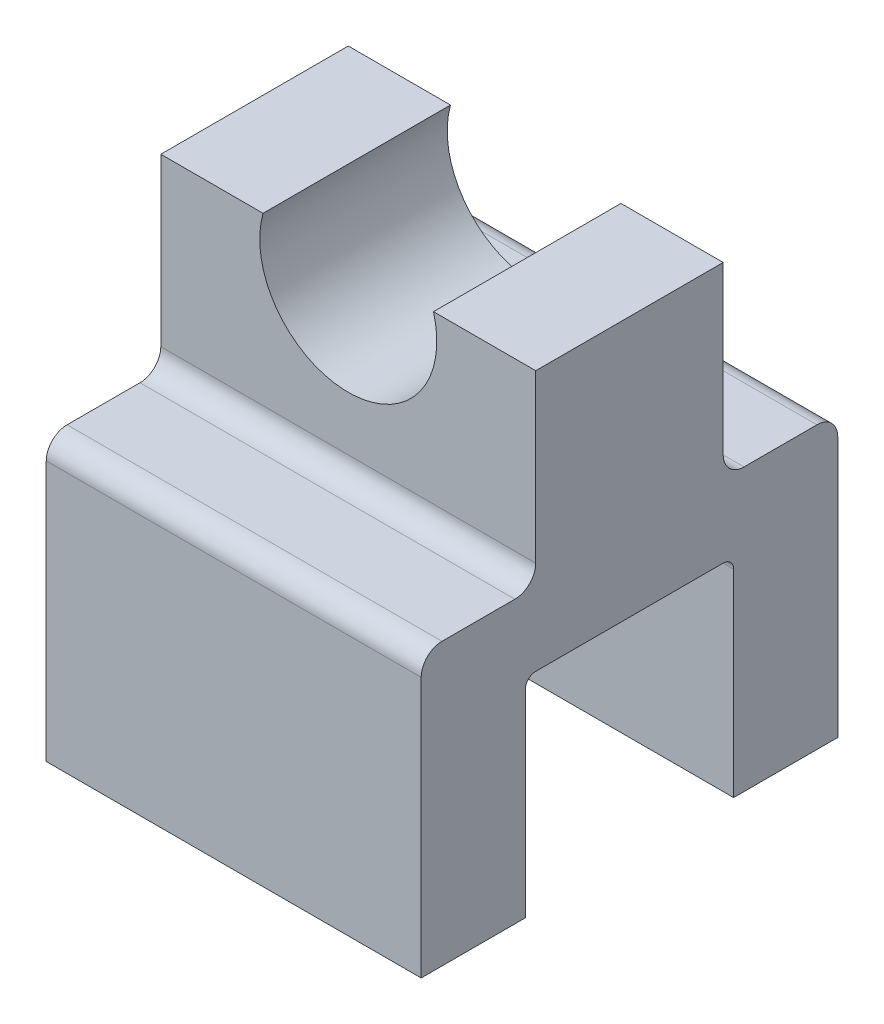
ISO-10303-21;
HEADER;
FILE_DESCRIPTION(('STEP AP214'),'2;1');
FILE_NAME('part.step','',(''),(''),'','','');
FILE_SCHEMA(('AUTOMOTIVE_DESIGN { 1 0 10303 214 1 1 1 1 }'));
ENDSEC;
DATA;
#1=APPLICATION_CONTEXT('core data for automotive mechanical design processes');
#2=APPLICATION_PROTOCOL_DEFINITION('international standard','automotive_design',2000,#1);
#3=PRODUCT_CONTEXT('',#1,'mechanical');
#4=PRODUCT('Part','Part','',(#3));
#5=PRODUCT_RELATED_PRODUCT_CATEGORY('part','',(#4));
#6=PRODUCT_DEFINITION_FORMATION('','',#4);
#7=PRODUCT_DEFINITION_CONTEXT('part definition',#1,'design');
#8=PRODUCT_DEFINITION('design','',#6,#7);
#9=PRODUCT_DEFINITION_SHAPE('','',#8);
#10=(LENGTH_UNIT() NAMED_UNIT(*) SI_UNIT(.MILLI.,.METRE.));
#11=(NAMED_UNIT(*) PLANE_ANGLE_UNIT() SI_UNIT($,.RADIAN.));
#12=(NAMED_UNIT(*) SI_UNIT($,.STERADIAN.) SOLID_ANGLE_UNIT());
#13=UNCERTAINTY_MEASURE_WITH_UNIT(LENGTH_MEASURE(1.E-05),#10,'distance_accuracy_value','');
#14=(GEOMETRIC_REPRESENTATION_CONTEXT(3) GLOBAL_UNCERTAINTY_ASSIGNED_CONTEXT((#13)) GLOBAL_UNIT_ASSIGNED_CONTEXT((#10,
#11,#12)) REPRESENTATION_CONTEXT('',''));
#15=CARTESIAN_POINT('',(0.,0.,0.));
#16=DIRECTION('',(0.,0.,1.));
#17=DIRECTION('',(1.,0.,0.));
#18=AXIS2_PLACEMENT_3D('',#15,#16,#17);
#19=CARTESIAN_POINT('',(0.,0.,50.8));
#20=DIRECTION('',(0.,1.,0.));
#21=DIRECTION('',(0.,0.,1.));
#22=AXIS2_PLACEMENT_3D('',#19,#20,#21);
#23=PLANE('',#22);
#24=DIRECTION('',(0.,0.,-1.));
#25=VECTOR('',#24,1.);
#26=CARTESIAN_POINT('',(0.,0.,50.8));
#27=LINE('',#26,#25);
#28=CARTESIAN_POINT('',(0.,0.,50.8));
#29=VERTEX_POINT('',#28);
#30=CARTESIAN_POINT('',(0.,0.,38.1));
#31=VERTEX_POINT('',#30);
#32=EDGE_CURVE('E226',#29,#31,#27,.T.);
#33=ORIENTED_EDGE('',*,*,#32,.T.);
#34=DIRECTION('',(1.,0.,0.));
#35=VECTOR('',#34,1.);
#36=CARTESIAN_POINT('',(0.,0.,38.1));
#37=LINE('',#36,#35);
#38=CARTESIAN_POINT('',(45.72,0.,38.1));
#39=VERTEX_POINT('',#38);
#40=EDGE_CURVE('E351',#31,#39,#37,.T.);
#41=ORIENTED_EDGE('',*,*,#40,.T.);
#42=DIRECTION('',(0.,0.,-1.));
#43=VECTOR('',#42,1.);
#44=CARTESIAN_POINT('',(45.72,0.,50.8));
#45=LINE('',#44,#43);
#46=CARTESIAN_POINT('',(45.72,0.,50.8));
#47=VERTEX_POINT('',#46);
#48=EDGE_CURVE('E217',#47,#39,#45,.T.);
#49=ORIENTED_EDGE('',*,*,#48,.F.);
#50=DIRECTION('',(1.,0.,0.));
#51=VECTOR('',#50,1.);
#52=CARTESIAN_POINT('',(0.,0.,50.8));
#53=LINE('',#52,#51);
#54=EDGE_CURVE('E371',#29,#47,#53,.T.);
#55=ORIENTED_EDGE('',*,*,#54,.F.);
#56=EDGE_LOOP('',(#33,#41,#49,#55));
#57=FACE_BOUND('',#56,.T.);
#58=ADVANCED_FACE('F45',(#57),#23,.F.);
#59=CARTESIAN_POINT('',(0.,0.,50.8));
#60=DIRECTION('',(1.,0.,0.));
#61=DIRECTION('',(0.,0.,-1.));
#62=AXIS2_PLACEMENT_3D('',#59,#60,#61);
#63=PLANE('',#62);
#64=DIRECTION('',(0.,0.,1.));
#65=VECTOR('',#64,1.);
#66=CARTESIAN_POINT('',(0.,34.29,0.));
#67=LINE('',#66,#65);
#68=CARTESIAN_POINT('',(0.,34.29,2.54));
#69=VERTEX_POINT('',#68);
#70=CARTESIAN_POINT('',(0.,34.29,11.43));
#71=VERTEX_POINT('',#70);
#72=EDGE_CURVE('E305',#69,#71,#67,.T.);
#73=ORIENTED_EDGE('',*,*,#72,.F.);
#74=CARTESIAN_POINT('',(0.,31.75,2.54));
#75=DIRECTION('',(1.,0.,0.));
#76=DIRECTION('',(0.,0.,-1.));
#77=AXIS2_PLACEMENT_3D('',#74,#75,#76);
#78=CIRCLE('',#77,2.54);
#79=CARTESIAN_POINT('',(0.,31.75,0.));
#80=VERTEX_POINT('',#79);
#81=EDGE_CURVE('E266',#69,#80,#78,.F.);
#82=ORIENTED_EDGE('',*,*,#81,.T.);
#83=DIRECTION('',(0.,-1.,0.));
#84=VECTOR('',#83,1.);
#85=CARTESIAN_POINT('',(0.,0.,0.));
#86=LINE('',#85,#84);
#87=CARTESIAN_POINT('',(0.,0.,0.));
#88=VERTEX_POINT('',#87);
#89=EDGE_CURVE('E364',#80,#88,#86,.T.);
#90=ORIENTED_EDGE('',*,*,#89,.T.);
#91=CARTESIAN_POINT('',(0.,0.,12.7));
#92=VERTEX_POINT('',#91);
#93=EDGE_CURVE('E225',#92,#88,#27,.T.);
#94=ORIENTED_EDGE('',*,*,#93,.F.);
#95=DIRECTION('',(0.,1.,0.));
#96=VECTOR('',#95,1.);
#97=CARTESIAN_POINT('',(0.,0.,12.7));
#98=LINE('',#97,#96);
#99=CARTESIAN_POINT('',(0.,24.13,12.7));
#100=VERTEX_POINT('',#99);
#101=EDGE_CURVE('E342',#92,#100,#98,.T.);
#102=ORIENTED_EDGE('',*,*,#101,.T.);
#103=CARTESIAN_POINT('',(0.,24.13,13.97));
#104=DIRECTION('',(1.,0.,0.));
#105=DIRECTION('',(0.,0.,-1.));
#106=AXIS2_PLACEMENT_3D('',#103,#104,#105);
#107=CIRCLE('',#106,1.27);
#108=CARTESIAN_POINT('',(0.,25.4,13.97));
#109=VERTEX_POINT('',#108);
#110=EDGE_CURVE('E253',#100,#109,#107,.T.);
#111=ORIENTED_EDGE('',*,*,#110,.T.);
#112=DIRECTION('',(0.,0.,1.));
#113=VECTOR('',#112,1.);
#114=CARTESIAN_POINT('',(0.,25.4,38.1));
#115=LINE('',#114,#113);
#116=CARTESIAN_POINT('',(0.,25.4,36.83));
#117=VERTEX_POINT('',#116);
#118=EDGE_CURVE('E347',#109,#117,#115,.T.);
#119=ORIENTED_EDGE('',*,*,#118,.T.);
#120=CARTESIAN_POINT('',(0.,24.13,36.83));
#121=DIRECTION('',(1.,0.,0.));
#122=DIRECTION('',(0.,0.,-1.));
#123=AXIS2_PLACEMENT_3D('',#120,#121,#122);
#124=CIRCLE('',#123,1.27);
#125=CARTESIAN_POINT('',(0.,24.13,38.1));
#126=VERTEX_POINT('',#125);
#127=EDGE_CURVE('E247',#117,#126,#124,.T.);
#128=ORIENTED_EDGE('',*,*,#127,.T.);
#129=DIRECTION('',(0.,-1.,0.));
#130=VECTOR('',#129,1.);
#131=CARTESIAN_POINT('',(0.,0.,38.1));
#132=LINE('',#131,#130);
#133=EDGE_CURVE('E339',#126,#31,#132,.T.);
#134=ORIENTED_EDGE('',*,*,#133,.T.);
#135=ORIENTED_EDGE('',*,*,#32,.F.);
#136=DIRECTION('',(0.,-1.,0.));
#137=VECTOR('',#136,1.);
#138=CARTESIAN_POINT('',(0.,0.,50.8));
#139=LINE('',#138,#137);
#140=CARTESIAN_POINT('',(0.,31.75,50.8));
#141=VERTEX_POINT('',#140);
#142=EDGE_CURVE('E368',#141,#29,#139,.T.);
#143=ORIENTED_EDGE('',*,*,#142,.F.);
#144=CARTESIAN_POINT('',(0.,31.75,48.26));
#145=DIRECTION('',(1.,0.,0.));
#146=DIRECTION('',(0.,0.,-1.));
#147=AXIS2_PLACEMENT_3D('',#144,#145,#146);
#148=CIRCLE('',#147,2.54);
#149=CARTESIAN_POINT('',(0.,34.29,48.26));
#150=VERTEX_POINT('',#149);
#151=EDGE_CURVE('E263',#141,#150,#148,.F.);
#152=ORIENTED_EDGE('',*,*,#151,.T.);
#153=DIRECTION('',(0.,0.,1.));
#154=VECTOR('',#153,1.);
#155=CARTESIAN_POINT('',(0.,34.29,50.8));
#156=LINE('',#155,#154);
#157=CARTESIAN_POINT('',(0.,34.29,39.37));
#158=VERTEX_POINT('',#157);
#159=EDGE_CURVE('E194',#158,#150,#156,.T.);
#160=ORIENTED_EDGE('',*,*,#159,.F.);
#161=CARTESIAN_POINT('',(0.,36.83,39.37));
#162=DIRECTION('',(1.,0.,0.));
#163=DIRECTION('',(0.,0.,-1.));
#164=AXIS2_PLACEMENT_3D('',#161,#162,#163);
#165=CIRCLE('',#164,2.54);
#166=CARTESIAN_POINT('',(0.,36.83,36.83));
#167=VERTEX_POINT('',#166);
#168=EDGE_CURVE('E294',#158,#167,#165,.T.);
#169=ORIENTED_EDGE('',*,*,#168,.T.);
#170=DIRECTION('',(0.,-1.,0.));
#171=VECTOR('',#170,1.);
#172=CARTESIAN_POINT('',(0.,57.15,36.83));
#173=LINE('',#172,#171);
#174=CARTESIAN_POINT('',(0.,57.15,36.83));
#175=VERTEX_POINT('',#174);
#176=EDGE_CURVE('E316',#175,#167,#173,.T.);
#177=ORIENTED_EDGE('',*,*,#176,.F.);
#178=DIRECTION('',(0.,0.,-1.));
#179=VECTOR('',#178,1.);
#180=CARTESIAN_POINT('',(0.,57.15,50.8));
#181=LINE('',#180,#179);
#182=CARTESIAN_POINT('',(0.,57.15,13.97));
#183=VERTEX_POINT('',#182);
#184=EDGE_CURVE('E378',#175,#183,#181,.T.);
#185=ORIENTED_EDGE('',*,*,#184,.T.);
#186=DIRECTION('',(0.,1.,0.));
#187=VECTOR('',#186,1.);
#188=CARTESIAN_POINT('',(0.,57.15,13.97));
#189=LINE('',#188,#187);
#190=CARTESIAN_POINT('',(0.,36.83,13.97));
#191=VERTEX_POINT('',#190);
#192=EDGE_CURVE('E307',#191,#183,#189,.T.);
#193=ORIENTED_EDGE('',*,*,#192,.F.);
#194=CARTESIAN_POINT('',(0.,36.83,11.43));
#195=DIRECTION('',(1.,0.,0.));
#196=DIRECTION('',(0.,0.,-1.));
#197=AXIS2_PLACEMENT_3D('',#194,#195,#196);
#198=CIRCLE('',#197,2.54);
#199=EDGE_CURVE('E54',#191,#71,#198,.T.);
#200=ORIENTED_EDGE('',*,*,#199,.T.);
#201=EDGE_LOOP('',(#73,#82,#90,#94,#102,#111,#119,#128,#134,#135,#143,#152,#160,#169,#177,#185,
#193,#200));
#202=FACE_BOUND('',#201,.T.);
#203=ADVANCED_FACE('F304',(#202),#63,.F.);
#204=CARTESIAN_POINT('',(45.72,0.,12.7));
#205=VERTEX_POINT('',#204);
#206=CARTESIAN_POINT('',(45.72,0.,0.));
#207=VERTEX_POINT('',#206);
#208=EDGE_CURVE('E213',#205,#207,#45,.T.);
#209=ORIENTED_EDGE('',*,*,#208,.F.);
#210=DIRECTION('',(1.,0.,0.));
#211=VECTOR('',#210,1.);
#212=CARTESIAN_POINT('',(0.,0.,12.7));
#213=LINE('',#212,#211);
#214=EDGE_CURVE('E361',#92,#205,#213,.T.);
#215=ORIENTED_EDGE('',*,*,#214,.F.);
#216=ORIENTED_EDGE('',*,*,#93,.T.);
#217=DIRECTION('',(1.,0.,0.));
#218=VECTOR('',#217,1.);
#219=CARTESIAN_POINT('',(0.,0.,0.));
#220=LINE('',#219,#218);
#221=EDGE_CURVE('E381',#88,#207,#220,.T.);
#222=ORIENTED_EDGE('',*,*,#221,.T.);
#223=EDGE_LOOP('',(#209,#215,#216,#222));
#224=FACE_BOUND('',#223,.T.);
#225=ADVANCED_FACE('F453',(#224),#23,.F.);
#226=CARTESIAN_POINT('',(45.72,0.,50.8));
#227=DIRECTION('',(-1.,0.,0.));
#228=DIRECTION('',(0.,0.,1.));
#229=AXIS2_PLACEMENT_3D('',#226,#227,#228);
#230=PLANE('',#229);
#231=DIRECTION('',(0.,1.,0.));
#232=VECTOR('',#231,1.);
#233=CARTESIAN_POINT('',(45.72,0.,0.));
#234=LINE('',#233,#232);
#235=CARTESIAN_POINT('',(45.72,31.75,0.));
#236=VERTEX_POINT('',#235);
#237=EDGE_CURVE('E372',#207,#236,#234,.T.);
#238=ORIENTED_EDGE('',*,*,#237,.T.);
#239=CARTESIAN_POINT('',(45.72,31.75,2.54));
#240=DIRECTION('',(-1.,0.,0.));
#241=DIRECTION('',(0.,0.,1.));
#242=AXIS2_PLACEMENT_3D('',#239,#240,#241);
#243=CIRCLE('',#242,2.54);
#244=CARTESIAN_POINT('',(45.72,34.29,2.54));
#245=VERTEX_POINT('',#244);
#246=EDGE_CURVE('E274',#236,#245,#243,.F.);
#247=ORIENTED_EDGE('',*,*,#246,.T.);
#248=DIRECTION('',(0.,0.,1.));
#249=VECTOR('',#248,1.);
#250=CARTESIAN_POINT('',(45.72,34.29,0.));
#251=LINE('',#250,#249);
#252=CARTESIAN_POINT('',(45.72,34.29,11.43));
#253=VERTEX_POINT('',#252);
#254=EDGE_CURVE('E323',#245,#253,#251,.T.);
#255=ORIENTED_EDGE('',*,*,#254,.T.);
#256=CARTESIAN_POINT('',(45.72,36.83,11.43));
#257=DIRECTION('',(-1.,0.,0.));
#258=DIRECTION('',(0.,0.,1.));
#259=AXIS2_PLACEMENT_3D('',#256,#257,#258);
#260=CIRCLE('',#259,2.54);
#261=CARTESIAN_POINT('',(45.72,36.83,13.97));
#262=VERTEX_POINT('',#261);
#263=EDGE_CURVE('E11',#253,#262,#260,.T.);
#264=ORIENTED_EDGE('',*,*,#263,.T.);
#265=DIRECTION('',(0.,1.,0.));
#266=VECTOR('',#265,1.);
#267=CARTESIAN_POINT('',(45.72,57.15,13.97));
#268=LINE('',#267,#266);
#269=CARTESIAN_POINT('',(45.72,57.15,13.97));
#270=VERTEX_POINT('',#269);
#271=EDGE_CURVE('E210',#262,#270,#268,.T.);
#272=ORIENTED_EDGE('',*,*,#271,.T.);
#273=DIRECTION('',(0.,0.,-1.));
#274=VECTOR('',#273,1.);
#275=CARTESIAN_POINT('',(45.72,57.15,50.8));
#276=LINE('',#275,#274);
#277=CARTESIAN_POINT('',(45.72,57.15,36.83));
#278=VERTEX_POINT('',#277);
#279=EDGE_CURVE('E201',#278,#270,#276,.T.);
#280=ORIENTED_EDGE('',*,*,#279,.F.);
#281=DIRECTION('',(0.,-1.,0.));
#282=VECTOR('',#281,1.);
#283=CARTESIAN_POINT('',(45.72,57.15,36.83));
#284=LINE('',#283,#282);
#285=CARTESIAN_POINT('',(45.72,36.83,36.83));
#286=VERTEX_POINT('',#285);
#287=EDGE_CURVE('E182',#278,#286,#284,.T.);
#288=ORIENTED_EDGE('',*,*,#287,.T.);
#289=CARTESIAN_POINT('',(45.72,36.83,39.37));
#290=DIRECTION('',(-1.,0.,0.));
#291=DIRECTION('',(0.,0.,1.));
#292=AXIS2_PLACEMENT_3D('',#289,#290,#291);
#293=CIRCLE('',#292,2.54);
#294=CARTESIAN_POINT('',(45.72,34.29,39.37));
#295=VERTEX_POINT('',#294);
#296=EDGE_CURVE('E297',#286,#295,#293,.T.);
#297=ORIENTED_EDGE('',*,*,#296,.T.);
#298=DIRECTION('',(0.,0.,1.));
#299=VECTOR('',#298,1.);
#300=CARTESIAN_POINT('',(45.72,34.29,50.8));
#301=LINE('',#300,#299);
#302=CARTESIAN_POINT('',(45.72,34.29,48.26));
#303=VERTEX_POINT('',#302);
#304=EDGE_CURVE('E193',#295,#303,#301,.T.);
#305=ORIENTED_EDGE('',*,*,#304,.T.);
#306=CARTESIAN_POINT('',(45.72,31.75,48.26));
#307=DIRECTION('',(-1.,0.,0.));
#308=DIRECTION('',(0.,0.,1.));
#309=AXIS2_PLACEMENT_3D('',#306,#307,#308);
#310=CIRCLE('',#309,2.54);
#311=CARTESIAN_POINT('',(45.72,31.75,50.8));
#312=VERTEX_POINT('',#311);
#313=EDGE_CURVE('E66',#303,#312,#310,.F.);
#314=ORIENTED_EDGE('',*,*,#313,.T.);
#315=DIRECTION('',(0.,1.,0.));
#316=VECTOR('',#315,1.);
#317=CARTESIAN_POINT('',(45.72,0.,50.8));
#318=LINE('',#317,#316);
#319=EDGE_CURVE('E375',#47,#312,#318,.T.);
#320=ORIENTED_EDGE('',*,*,#319,.F.);
#321=ORIENTED_EDGE('',*,*,#48,.T.);
#322=DIRECTION('',(0.,-1.,0.));
#323=VECTOR('',#322,1.);
#324=CARTESIAN_POINT('',(45.72,0.,38.1));
#325=LINE('',#324,#323);
#326=CARTESIAN_POINT('',(45.72,24.13,38.1));
#327=VERTEX_POINT('',#326);
#328=EDGE_CURVE('E338',#327,#39,#325,.T.);
#329=ORIENTED_EDGE('',*,*,#328,.F.);
#330=CARTESIAN_POINT('',(45.72,24.13,36.83));
#331=DIRECTION('',(-1.,0.,0.));
#332=DIRECTION('',(0.,0.,1.));
#333=AXIS2_PLACEMENT_3D('',#330,#331,#332);
#334=CIRCLE('',#333,1.27);
#335=CARTESIAN_POINT('',(45.72,25.4,36.83));
#336=VERTEX_POINT('',#335);
#337=EDGE_CURVE('E244',#327,#336,#334,.T.);
#338=ORIENTED_EDGE('',*,*,#337,.T.);
#339=DIRECTION('',(0.,0.,1.));
#340=VECTOR('',#339,1.);
#341=CARTESIAN_POINT('',(45.72,25.4,38.1));
#342=LINE('',#341,#340);
#343=CARTESIAN_POINT('',(45.72,25.4,13.97));
#344=VERTEX_POINT('',#343);
#345=EDGE_CURVE('E343',#344,#336,#342,.T.);
#346=ORIENTED_EDGE('',*,*,#345,.F.);
#347=CARTESIAN_POINT('',(45.72,24.13,13.97));
#348=DIRECTION('',(-1.,0.,0.));
#349=DIRECTION('',(0.,0.,1.));
#350=AXIS2_PLACEMENT_3D('',#347,#348,#349);
#351=CIRCLE('',#350,1.27);
#352=CARTESIAN_POINT('',(45.72,24.13,12.7));
#353=VERTEX_POINT('',#352);
#354=EDGE_CURVE('E250',#344,#353,#351,.T.);
#355=ORIENTED_EDGE('',*,*,#354,.T.);
#356=DIRECTION('',(0.,1.,0.));
#357=VECTOR('',#356,1.);
#358=CARTESIAN_POINT('',(45.72,0.,12.7));
#359=LINE('',#358,#357);
#360=EDGE_CURVE('E354',#205,#353,#359,.T.);
#361=ORIENTED_EDGE('',*,*,#360,.F.);
#362=ORIENTED_EDGE('',*,*,#208,.T.);
#363=EDGE_LOOP('',(#238,#247,#255,#264,#272,#280,#288,#297,#305,#314,#320,#321,#329,#338,#346,
#355,#361,#362));
#364=FACE_BOUND('',#363,.T.);
#365=ADVANCED_FACE('F209',(#364),#230,.F.);
#366=CARTESIAN_POINT('',(33.2522944531032,57.15,50.8));
#367=DIRECTION('',(0.,-1.,0.));
#368=DIRECTION('',(0.,0.,-1.));
#369=AXIS2_PLACEMENT_3D('',#366,#367,#368);
#370=PLANE('',#369);
#371=DIRECTION('',(0.,0.,-1.));
#372=VECTOR('',#371,1.);
#373=CARTESIAN_POINT('',(33.2522944531032,57.15,50.8));
#374=LINE('',#373,#372);
#375=CARTESIAN_POINT('',(33.2522944531032,57.15,36.83));
#376=VERTEX_POINT('',#375);
#377=CARTESIAN_POINT('',(33.2522944531032,57.15,13.97));
#378=VERTEX_POINT('',#377);
#379=EDGE_CURVE('E203',#376,#378,#374,.T.);
#380=ORIENTED_EDGE('',*,*,#379,.F.);
#381=DIRECTION('',(-1.,0.,0.));
#382=VECTOR('',#381,1.);
#383=CARTESIAN_POINT('',(45.72,57.15,36.83));
#384=LINE('',#383,#382);
#385=EDGE_CURVE('E186',#278,#376,#384,.T.);
#386=ORIENTED_EDGE('',*,*,#385,.F.);
#387=ORIENTED_EDGE('',*,*,#279,.T.);
#388=DIRECTION('',(-1.,0.,0.));
#389=VECTOR('',#388,1.);
#390=CARTESIAN_POINT('',(45.72,57.15,13.97));
#391=LINE('',#390,#389);
#392=EDGE_CURVE('E321',#270,#378,#391,.T.);
#393=ORIENTED_EDGE('',*,*,#392,.T.);
#394=EDGE_LOOP('',(#380,#386,#387,#393));
#395=FACE_BOUND('',#394,.T.);
#396=ADVANCED_FACE('F199',(#395),#370,.F.);
#397=CARTESIAN_POINT('',(22.86,54.229,50.8));
#398=DIRECTION('',(0.,0.,-1.));
#399=DIRECTION('',(-1.,0.,0.));
#400=AXIS2_PLACEMENT_3D('',#397,#398,#399);
#401=CYLINDRICAL_SURFACE('',#400,10.795);
#402=DIRECTION('',(0.,0.,-1.));
#403=VECTOR('',#402,1.);
#404=CARTESIAN_POINT('',(12.4677055468968,57.15,50.8));
#405=LINE('',#404,#403);
#406=CARTESIAN_POINT('',(12.4677055468968,57.15,36.83));
#407=VERTEX_POINT('',#406);
#408=CARTESIAN_POINT('',(12.4677055468968,57.15,13.97));
#409=VERTEX_POINT('',#408);
#410=EDGE_CURVE('E219',#407,#409,#405,.T.);
#411=ORIENTED_EDGE('',*,*,#410,.F.);
#412=CARTESIAN_POINT('',(22.86,54.229,36.83));
#413=DIRECTION('',(0.,0.,-1.));
#414=DIRECTION('',(0.,1.,0.));
#415=AXIS2_PLACEMENT_3D('',#412,#413,#414);
#416=CIRCLE('',#415,10.795);
#417=EDGE_CURVE('E335',#407,#376,#416,.F.);
#418=ORIENTED_EDGE('',*,*,#417,.T.);
#419=ORIENTED_EDGE('',*,*,#379,.T.);
#420=CARTESIAN_POINT('',(22.86,54.229,13.97));
#421=DIRECTION('',(0.,0.,1.));
#422=DIRECTION('',(0.,-1.,0.));
#423=AXIS2_PLACEMENT_3D('',#420,#421,#422);
#424=CIRCLE('',#423,10.795);
#425=EDGE_CURVE('E205',#378,#409,#424,.F.);
#426=ORIENTED_EDGE('',*,*,#425,.T.);
#427=EDGE_LOOP('',(#411,#418,#419,#426));
#428=FACE_BOUND('',#427,.T.);
#429=ADVANCED_FACE('F396',(#428),#401,.F.);
#430=CARTESIAN_POINT('',(0.,57.15,50.8));
#431=DIRECTION('',(0.,-1.,0.));
#432=DIRECTION('',(0.,0.,-1.));
#433=AXIS2_PLACEMENT_3D('',#430,#431,#432);
#434=PLANE('',#433);
#435=ORIENTED_EDGE('',*,*,#184,.F.);
#436=EDGE_CURVE('E206',#407,#175,#384,.T.);
#437=ORIENTED_EDGE('',*,*,#436,.F.);
#438=ORIENTED_EDGE('',*,*,#410,.T.);
#439=EDGE_CURVE('E328',#409,#183,#391,.T.);
#440=ORIENTED_EDGE('',*,*,#439,.T.);
#441=EDGE_LOOP('',(#435,#437,#438,#440));
#442=FACE_BOUND('',#441,.T.);
#443=ADVANCED_FACE('F394',(#442),#434,.F.);
#444=CARTESIAN_POINT('',(22.86,54.229,50.8));
#445=DIRECTION('',(0.,0.,1.));
#446=DIRECTION('',(1.,0.,0.));
#447=AXIS2_PLACEMENT_3D('',#444,#445,#446);
#448=PLANE('',#447);
#449=ORIENTED_EDGE('',*,*,#319,.T.);
#450=DIRECTION('',(-1.,0.,0.));
#451=VECTOR('',#450,1.);
#452=CARTESIAN_POINT('',(0.,31.75,50.8));
#453=LINE('',#452,#451);
#454=EDGE_CURVE('E277',#312,#141,#453,.T.);
#455=ORIENTED_EDGE('',*,*,#454,.T.);
#456=ORIENTED_EDGE('',*,*,#142,.T.);
#457=ORIENTED_EDGE('',*,*,#54,.T.);
#458=EDGE_LOOP('',(#449,#455,#456,#457));
#459=FACE_BOUND('',#458,.T.);
#460=ADVANCED_FACE('F421',(#459),#448,.T.);
#461=CARTESIAN_POINT('',(22.86,54.229,0.));
#462=DIRECTION('',(0.,0.,1.));
#463=DIRECTION('',(1.,0.,0.));
#464=AXIS2_PLACEMENT_3D('',#461,#462,#463);
#465=PLANE('',#464);
#466=ORIENTED_EDGE('',*,*,#89,.F.);
#467=DIRECTION('',(-1.,0.,0.));
#468=VECTOR('',#467,1.);
#469=CARTESIAN_POINT('',(22.86,31.75,0.));
#470=LINE('',#469,#468);
#471=EDGE_CURVE('E269',#80,#236,#470,.F.);
#472=ORIENTED_EDGE('',*,*,#471,.T.);
#473=ORIENTED_EDGE('',*,*,#237,.F.);
#474=ORIENTED_EDGE('',*,*,#221,.F.);
#475=EDGE_LOOP('',(#466,#472,#473,#474));
#476=FACE_BOUND('',#475,.T.);
#477=ADVANCED_FACE('F459',(#476),#465,.F.);
#478=CARTESIAN_POINT('',(0.,0.,38.1));
#479=DIRECTION('',(0.,0.,1.));
#480=DIRECTION('',(1.,0.,0.));
#481=AXIS2_PLACEMENT_3D('',#478,#479,#480);
#482=PLANE('',#481);
#483=ORIENTED_EDGE('',*,*,#133,.F.);
#484=DIRECTION('',(1.,0.,0.));
#485=VECTOR('',#484,1.);
#486=CARTESIAN_POINT('',(45.72,24.13,38.1));
#487=LINE('',#486,#485);
#488=EDGE_CURVE('E230',#126,#327,#487,.T.);
#489=ORIENTED_EDGE('',*,*,#488,.T.);
#490=ORIENTED_EDGE('',*,*,#328,.T.);
#491=ORIENTED_EDGE('',*,*,#40,.F.);
#492=EDGE_LOOP('',(#483,#489,#490,#491));
#493=FACE_BOUND('',#492,.T.);
#494=ADVANCED_FACE('F431',(#493),#482,.F.);
#495=CARTESIAN_POINT('',(0.,25.4,38.1));
#496=DIRECTION('',(0.,1.,0.));
#497=DIRECTION('',(0.,0.,1.));
#498=AXIS2_PLACEMENT_3D('',#495,#496,#497);
#499=PLANE('',#498);
#500=ORIENTED_EDGE('',*,*,#345,.T.);
#501=DIRECTION('',(1.,0.,0.));
#502=VECTOR('',#501,1.);
#503=CARTESIAN_POINT('',(0.,25.4,36.83));
#504=LINE('',#503,#502);
#505=EDGE_CURVE('E238',#336,#117,#504,.F.);
#506=ORIENTED_EDGE('',*,*,#505,.T.);
#507=ORIENTED_EDGE('',*,*,#118,.F.);
#508=DIRECTION('',(1.,0.,0.));
#509=VECTOR('',#508,1.);
#510=CARTESIAN_POINT('',(45.72,25.4,13.97));
#511=LINE('',#510,#509);
#512=EDGE_CURVE('E234',#109,#344,#511,.T.);
#513=ORIENTED_EDGE('',*,*,#512,.T.);
#514=EDGE_LOOP('',(#500,#506,#507,#513));
#515=FACE_BOUND('',#514,.T.);
#516=ADVANCED_FACE('F439',(#515),#499,.F.);
#517=CARTESIAN_POINT('',(0.,0.,12.7));
#518=DIRECTION('',(0.,0.,-1.));
#519=DIRECTION('',(-1.,0.,0.));
#520=AXIS2_PLACEMENT_3D('',#517,#518,#519);
#521=PLANE('',#520);
#522=ORIENTED_EDGE('',*,*,#360,.T.);
#523=DIRECTION('',(1.,0.,0.));
#524=VECTOR('',#523,1.);
#525=CARTESIAN_POINT('',(0.,24.13,12.7));
#526=LINE('',#525,#524);
#527=EDGE_CURVE('E241',#353,#100,#526,.F.);
#528=ORIENTED_EDGE('',*,*,#527,.T.);
#529=ORIENTED_EDGE('',*,*,#101,.F.);
#530=ORIENTED_EDGE('',*,*,#214,.T.);
#531=EDGE_LOOP('',(#522,#528,#529,#530));
#532=FACE_BOUND('',#531,.T.);
#533=ADVANCED_FACE('F449',(#532),#521,.F.);
#534=CARTESIAN_POINT('',(0.,24.13,36.83));
#535=DIRECTION('',(-1.,0.,0.));
#536=DIRECTION('',(0.,0.,1.));
#537=AXIS2_PLACEMENT_3D('',#534,#535,#536);
#538=CYLINDRICAL_SURFACE('',#537,1.27);
#539=ORIENTED_EDGE('',*,*,#127,.F.);
#540=ORIENTED_EDGE('',*,*,#505,.F.);
#541=ORIENTED_EDGE('',*,*,#337,.F.);
#542=ORIENTED_EDGE('',*,*,#488,.F.);
#543=EDGE_LOOP('',(#539,#540,#541,#542));
#544=FACE_BOUND('',#543,.T.);
#545=ADVANCED_FACE('F435',(#544),#538,.F.);
#546=CARTESIAN_POINT('',(0.,24.13,13.97));
#547=DIRECTION('',(-1.,0.,0.));
#548=DIRECTION('',(0.,0.,1.));
#549=AXIS2_PLACEMENT_3D('',#546,#547,#548);
#550=CYLINDRICAL_SURFACE('',#549,1.27);
#551=ORIENTED_EDGE('',*,*,#110,.F.);
#552=ORIENTED_EDGE('',*,*,#527,.F.);
#553=ORIENTED_EDGE('',*,*,#354,.F.);
#554=ORIENTED_EDGE('',*,*,#512,.F.);
#555=EDGE_LOOP('',(#551,#552,#553,#554));
#556=FACE_BOUND('',#555,.T.);
#557=ADVANCED_FACE('F445',(#556),#550,.F.);
#558=CARTESIAN_POINT('',(45.72,57.15,13.97));
#559=DIRECTION('',(0.,0.,1.));
#560=DIRECTION('',(0.,-1.,0.));
#561=AXIS2_PLACEMENT_3D('',#558,#559,#560);
#562=PLANE('',#561);
#563=ORIENTED_EDGE('',*,*,#271,.F.);
#564=DIRECTION('',(-1.,0.,0.));
#565=VECTOR('',#564,1.);
#566=CARTESIAN_POINT('',(0.,36.83,13.97));
#567=LINE('',#566,#565);
#568=EDGE_CURVE('E290',#262,#191,#567,.T.);
#569=ORIENTED_EDGE('',*,*,#568,.T.);
#570=ORIENTED_EDGE('',*,*,#192,.T.);
#571=ORIENTED_EDGE('',*,*,#439,.F.);
#572=ORIENTED_EDGE('',*,*,#425,.F.);
#573=ORIENTED_EDGE('',*,*,#392,.F.);
#574=EDGE_LOOP('',(#563,#569,#570,#571,#572,#573));
#575=FACE_BOUND('',#574,.T.);
#576=ADVANCED_FACE('F319',(#575),#562,.F.);
#577=CARTESIAN_POINT('',(45.72,34.29,0.));
#578=DIRECTION('',(0.,-1.,0.));
#579=DIRECTION('',(0.,0.,-1.));
#580=AXIS2_PLACEMENT_3D('',#577,#578,#579);
#581=PLANE('',#580);
#582=ORIENTED_EDGE('',*,*,#254,.F.);
#583=DIRECTION('',(-1.,0.,0.));
#584=VECTOR('',#583,1.);
#585=CARTESIAN_POINT('',(45.72,34.29,2.54));
#586=LINE('',#585,#584);
#587=EDGE_CURVE('E259',#245,#69,#586,.T.);
#588=ORIENTED_EDGE('',*,*,#587,.T.);
#589=ORIENTED_EDGE('',*,*,#72,.T.);
#590=DIRECTION('',(-1.,0.,0.));
#591=VECTOR('',#590,1.);
#592=CARTESIAN_POINT('',(45.72,34.29,11.43));
#593=LINE('',#592,#591);
#594=EDGE_CURVE('E256',#71,#253,#593,.F.);
#595=ORIENTED_EDGE('',*,*,#594,.T.);
#596=EDGE_LOOP('',(#582,#588,#589,#595));
#597=FACE_BOUND('',#596,.T.);
#598=ADVANCED_FACE('F313',(#597),#581,.F.);
#599=CARTESIAN_POINT('',(45.72,57.15,36.83));
#600=DIRECTION('',(0.,0.,-1.));
#601=DIRECTION('',(0.,1.,0.));
#602=AXIS2_PLACEMENT_3D('',#599,#600,#601);
#603=PLANE('',#602);
#604=ORIENTED_EDGE('',*,*,#176,.T.);
#605=DIRECTION('',(-1.,0.,0.));
#606=VECTOR('',#605,1.);
#607=CARTESIAN_POINT('',(45.72,36.83,36.83));
#608=LINE('',#607,#606);
#609=EDGE_CURVE('E189',#167,#286,#608,.F.);
#610=ORIENTED_EDGE('',*,*,#609,.T.);
#611=ORIENTED_EDGE('',*,*,#287,.F.);
#612=ORIENTED_EDGE('',*,*,#385,.T.);
#613=ORIENTED_EDGE('',*,*,#417,.F.);
#614=ORIENTED_EDGE('',*,*,#436,.T.);
#615=EDGE_LOOP('',(#604,#610,#611,#612,#613,#614));
#616=FACE_BOUND('',#615,.T.);
#617=ADVANCED_FACE('F185',(#616),#603,.F.);
#618=CARTESIAN_POINT('',(45.72,34.29,50.8));
#619=DIRECTION('',(0.,-1.,0.));
#620=DIRECTION('',(0.,0.,-1.));
#621=AXIS2_PLACEMENT_3D('',#618,#619,#620);
#622=PLANE('',#621);
#623=ORIENTED_EDGE('',*,*,#159,.T.);
#624=DIRECTION('',(-1.,0.,0.));
#625=VECTOR('',#624,1.);
#626=CARTESIAN_POINT('',(45.72,34.29,48.26));
#627=LINE('',#626,#625);
#628=EDGE_CURVE('E285',#150,#303,#627,.F.);
#629=ORIENTED_EDGE('',*,*,#628,.T.);
#630=ORIENTED_EDGE('',*,*,#304,.F.);
#631=DIRECTION('',(-1.,0.,0.));
#632=VECTOR('',#631,1.);
#633=CARTESIAN_POINT('',(0.,34.29,39.37));
#634=LINE('',#633,#632);
#635=EDGE_CURVE('E281',#295,#158,#634,.T.);
#636=ORIENTED_EDGE('',*,*,#635,.T.);
#637=EDGE_LOOP('',(#623,#629,#630,#636));
#638=FACE_BOUND('',#637,.T.);
#639=ADVANCED_FACE('F414',(#638),#622,.F.);
#640=CARTESIAN_POINT('',(45.72,31.75,2.54));
#641=DIRECTION('',(-1.,0.,0.));
#642=DIRECTION('',(0.,0.,1.));
#643=AXIS2_PLACEMENT_3D('',#640,#641,#642);
#644=CYLINDRICAL_SURFACE('',#643,2.54);
#645=ORIENTED_EDGE('',*,*,#246,.F.);
#646=ORIENTED_EDGE('',*,*,#471,.F.);
#647=ORIENTED_EDGE('',*,*,#81,.F.);
#648=ORIENTED_EDGE('',*,*,#587,.F.);
#649=EDGE_LOOP('',(#645,#646,#647,#648));
#650=FACE_BOUND('',#649,.T.);
#651=ADVANCED_FACE('F463',(#650),#644,.T.);
#652=CARTESIAN_POINT('',(22.86,31.75,48.26));
#653=DIRECTION('',(1.,0.,0.));
#654=DIRECTION('',(0.,0.,-1.));
#655=AXIS2_PLACEMENT_3D('',#652,#653,#654);
#656=CYLINDRICAL_SURFACE('',#655,2.54);
#657=ORIENTED_EDGE('',*,*,#313,.F.);
#658=ORIENTED_EDGE('',*,*,#628,.F.);
#659=ORIENTED_EDGE('',*,*,#151,.F.);
#660=ORIENTED_EDGE('',*,*,#454,.F.);
#661=EDGE_LOOP('',(#657,#658,#659,#660));
#662=FACE_BOUND('',#661,.T.);
#663=ADVANCED_FACE('F418',(#662),#656,.T.);
#664=CARTESIAN_POINT('',(45.72,36.83,39.37));
#665=DIRECTION('',(1.,0.,0.));
#666=DIRECTION('',(0.,0.,-1.));
#667=AXIS2_PLACEMENT_3D('',#664,#665,#666);
#668=CYLINDRICAL_SURFACE('',#667,2.54);
#669=ORIENTED_EDGE('',*,*,#296,.F.);
#670=ORIENTED_EDGE('',*,*,#609,.F.);
#671=ORIENTED_EDGE('',*,*,#168,.F.);
#672=ORIENTED_EDGE('',*,*,#635,.F.);
#673=EDGE_LOOP('',(#669,#670,#671,#672));
#674=FACE_BOUND('',#673,.T.);
#675=ADVANCED_FACE('F411',(#674),#668,.F.);
#676=CARTESIAN_POINT('',(45.72,36.83,11.43));
#677=DIRECTION('',(1.,0.,0.));
#678=DIRECTION('',(0.,0.,-1.));
#679=AXIS2_PLACEMENT_3D('',#676,#677,#678);
#680=CYLINDRICAL_SURFACE('',#679,2.54);
#681=ORIENTED_EDGE('',*,*,#263,.F.);
#682=ORIENTED_EDGE('',*,*,#594,.F.);
#683=ORIENTED_EDGE('',*,*,#199,.F.);
#684=ORIENTED_EDGE('',*,*,#568,.F.);
#685=EDGE_LOOP('',(#681,#682,#683,#684));
#686=FACE_BOUND('',#685,.T.);
#687=ADVANCED_FACE('F47',(#686),#680,.F.);
#688=CLOSED_SHELL('',(#58,#203,#225,#365,#396,#429,#443,#460,#477,#494,#516,#533,#545,#557,#576,
#598,#617,#639,#651,#663,#675,#687));
#689=MANIFOLD_SOLID_BREP('B2',#688);
#690=ADVANCED_BREP_SHAPE_REPRESENTATION('',(#18,#689),#14);
#691=SHAPE_DEFINITION_REPRESENTATION(#9,#690);
ENDSEC;
END-ISO-10303-21;
